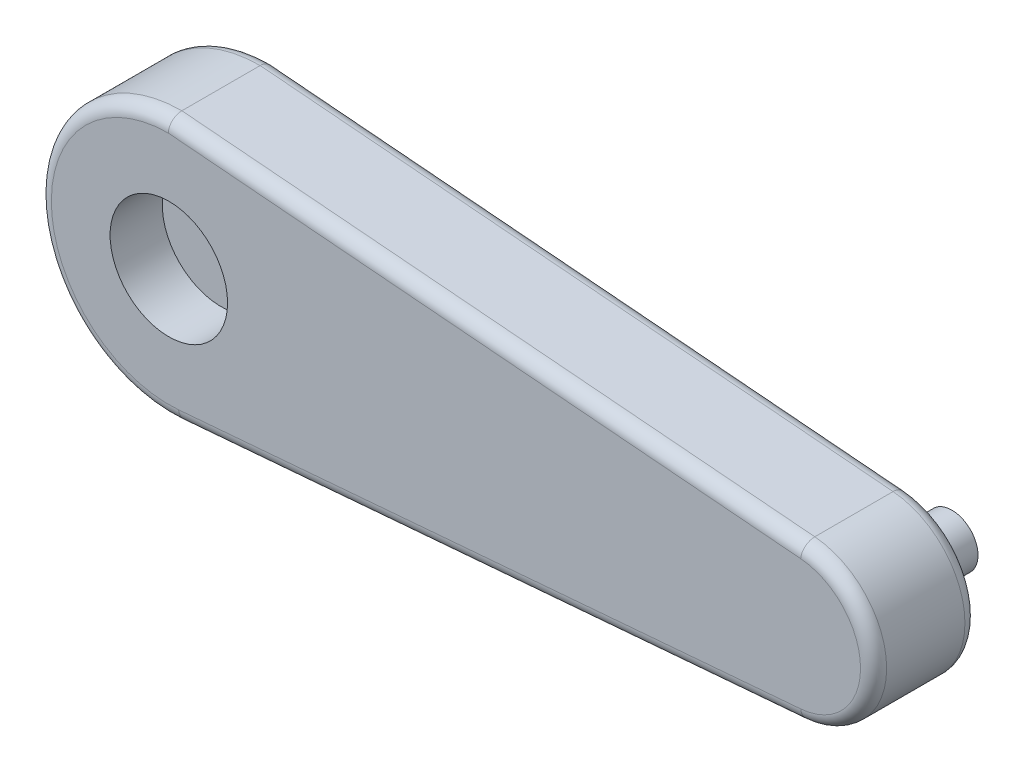
ISO-10303-21;
HEADER;
FILE_DESCRIPTION(('STEP AP214'),'2;1');
FILE_NAME('part.step','',(''),(''),'','','');
FILE_SCHEMA(('AUTOMOTIVE_DESIGN { 1 0 10303 214 1 1 1 1 }'));
ENDSEC;
DATA;
#1=APPLICATION_CONTEXT('core data for automotive mechanical design processes');
#2=APPLICATION_PROTOCOL_DEFINITION('international standard','automotive_design',2000,#1);
#3=PRODUCT_CONTEXT('',#1,'mechanical');
#4=PRODUCT('Part','Part','',(#3));
#5=PRODUCT_RELATED_PRODUCT_CATEGORY('part','',(#4));
#6=PRODUCT_DEFINITION_FORMATION('','',#4);
#7=PRODUCT_DEFINITION_CONTEXT('part definition',#1,'design');
#8=PRODUCT_DEFINITION('design','',#6,#7);
#9=PRODUCT_DEFINITION_SHAPE('','',#8);
#10=(LENGTH_UNIT() NAMED_UNIT(*) SI_UNIT(.MILLI.,.METRE.));
#11=(NAMED_UNIT(*) PLANE_ANGLE_UNIT() SI_UNIT($,.RADIAN.));
#12=(NAMED_UNIT(*) SI_UNIT($,.STERADIAN.) SOLID_ANGLE_UNIT());
#13=UNCERTAINTY_MEASURE_WITH_UNIT(LENGTH_MEASURE(1.E-05),#10,'distance_accuracy_value','');
#14=(GEOMETRIC_REPRESENTATION_CONTEXT(3) GLOBAL_UNCERTAINTY_ASSIGNED_CONTEXT((#13)) GLOBAL_UNIT_ASSIGNED_CONTEXT((#10,
#11,#12)) REPRESENTATION_CONTEXT('',''));
#15=CARTESIAN_POINT('',(0.,0.,0.));
#16=DIRECTION('',(0.,0.,1.));
#17=DIRECTION('',(1.,0.,0.));
#18=AXIS2_PLACEMENT_3D('',#15,#16,#17);
#19=CARTESIAN_POINT('',(1.7139175257732,-20.4954726653671,20.));
#20=DIRECTION('',(-0.0833333333333334,0.996521728591783,0.));
#21=DIRECTION('',(-0.996521728591783,-0.0833333333333334,0.));
#22=AXIS2_PLACEMENT_3D('',#19,#20,#21);
#23=PLANE('',#22);
#24=DIRECTION('',(0.,0.,-1.));
#25=VECTOR('',#24,1.);
#26=CARTESIAN_POINT('',(-51.1125429553264,-24.9130432147946,20.));
#27=LINE('',#26,#25);
#28=CARTESIAN_POINT('',(-51.1125429553264,-24.9130432147946,17.5));
#29=VERTEX_POINT('',#28);
#30=CARTESIAN_POINT('',(-51.1125429553264,-24.9130432147946,2.5));
#31=VERTEX_POINT('',#30);
#32=EDGE_CURVE('E227',#29,#31,#27,.T.);
#33=ORIENTED_EDGE('',*,*,#32,.T.);
#34=DIRECTION('',(0.996521728591783,0.0833333333333334,0.));
#35=VECTOR('',#34,1.);
#36=CARTESIAN_POINT('',(1.7139175257732,-20.4954726653671,2.5));
#37=LINE('',#36,#35);
#38=CARTESIAN_POINT('',(68.0541237113402,-14.9478259288767,2.5));
#39=VERTEX_POINT('',#38);
#40=EDGE_CURVE('E63',#31,#39,#37,.T.);
#41=ORIENTED_EDGE('',*,*,#40,.T.);
#42=DIRECTION('',(0.,0.,-1.));
#43=VECTOR('',#42,1.);
#44=CARTESIAN_POINT('',(68.0541237113402,-14.9478259288767,20.));
#45=LINE('',#44,#43);
#46=CARTESIAN_POINT('',(68.0541237113402,-14.9478259288767,17.5));
#47=VERTEX_POINT('',#46);
#48=EDGE_CURVE('E136',#47,#39,#45,.T.);
#49=ORIENTED_EDGE('',*,*,#48,.F.);
#50=DIRECTION('',(0.996521728591783,0.0833333333333334,0.));
#51=VECTOR('',#50,1.);
#52=CARTESIAN_POINT('',(-51.1125429553264,-24.9130432147946,17.5));
#53=LINE('',#52,#51);
#54=EDGE_CURVE('E146',#47,#29,#53,.F.);
#55=ORIENTED_EDGE('',*,*,#54,.T.);
#56=EDGE_LOOP('',(#33,#41,#49,#55));
#57=FACE_BOUND('',#56,.T.);
#58=ADVANCED_FACE('F39',(#57),#23,.F.);
#59=CARTESIAN_POINT('',(66.8041237113402,0.,20.));
#60=DIRECTION('',(0.,0.,-1.));
#61=DIRECTION('',(-1.,0.,0.));
#62=AXIS2_PLACEMENT_3D('',#59,#60,#61);
#63=CYLINDRICAL_SURFACE('',#62,15.);
#64=ORIENTED_EDGE('',*,*,#48,.T.);
#65=CARTESIAN_POINT('',(66.8041237113402,0.,2.5));
#66=DIRECTION('',(0.,0.,1.));
#67=DIRECTION('',(1.,0.,0.));
#68=AXIS2_PLACEMENT_3D('',#65,#66,#67);
#69=CIRCLE('',#68,15.);
#70=CARTESIAN_POINT('',(68.0434394502578,14.9487155468044,2.5));
#71=VERTEX_POINT('',#70);
#72=EDGE_CURVE('E48',#39,#71,#69,.T.);
#73=ORIENTED_EDGE('',*,*,#72,.T.);
#74=DIRECTION('',(0.,0.,-1.));
#75=VECTOR('',#74,1.);
#76=CARTESIAN_POINT('',(68.0434394502578,14.9487155468044,20.));
#77=LINE('',#76,#75);
#78=CARTESIAN_POINT('',(68.0434394502578,14.9487155468044,17.5));
#79=VERTEX_POINT('',#78);
#80=EDGE_CURVE('E234',#79,#71,#77,.T.);
#81=ORIENTED_EDGE('',*,*,#80,.F.);
#82=CARTESIAN_POINT('',(66.8041237113402,0.,17.5));
#83=DIRECTION('',(0.,0.,1.));
#84=DIRECTION('',(1.,0.,0.));
#85=AXIS2_PLACEMENT_3D('',#82,#83,#84);
#86=CIRCLE('',#85,15.);
#87=EDGE_CURVE('E124',#79,#47,#86,.F.);
#88=ORIENTED_EDGE('',*,*,#87,.T.);
#89=EDGE_LOOP('',(#64,#73,#81,#88));
#90=FACE_BOUND('',#89,.T.);
#91=ADVANCED_FACE('F241',(#90),#63,.T.);
#92=CARTESIAN_POINT('',(1.69533657212367,20.449271623796,20.));
#93=DIRECTION('',(0.0826210492611721,0.996581036453626,0.));
#94=DIRECTION('',(-0.996581036453626,0.0826210492611721,0.));
#95=AXIS2_PLACEMENT_3D('',#92,#93,#94);
#96=PLANE('',#95);
#97=ORIENTED_EDGE('',*,*,#80,.T.);
#98=DIRECTION('',(0.996581036453626,-0.0826210492611721,0.));
#99=VECTOR('',#98,1.);
#100=CARTESIAN_POINT('',(-53.1958762886598,25.,2.5));
#101=LINE('',#100,#99);
#102=CARTESIAN_POINT('',(-53.1958762886598,25.,2.5));
#103=VERTEX_POINT('',#102);
#104=EDGE_CURVE('E11',#71,#103,#101,.F.);
#105=ORIENTED_EDGE('',*,*,#104,.T.);
#106=DIRECTION('',(0.,0.,-1.));
#107=VECTOR('',#106,1.);
#108=CARTESIAN_POINT('',(-53.1958762886598,25.,20.));
#109=LINE('',#108,#107);
#110=CARTESIAN_POINT('',(-53.1958762886598,25.,17.5));
#111=VERTEX_POINT('',#110);
#112=EDGE_CURVE('E230',#111,#103,#109,.T.);
#113=ORIENTED_EDGE('',*,*,#112,.F.);
#114=DIRECTION('',(0.996581036453626,-0.0826210492611721,0.));
#115=VECTOR('',#114,1.);
#116=CARTESIAN_POINT('',(1.69533657212367,20.449271623796,17.5));
#117=LINE('',#116,#115);
#118=EDGE_CURVE('E149',#111,#79,#117,.T.);
#119=ORIENTED_EDGE('',*,*,#118,.T.);
#120=EDGE_LOOP('',(#97,#105,#113,#119));
#121=FACE_BOUND('',#120,.T.);
#122=ADVANCED_FACE('F244',(#121),#96,.T.);
#123=CARTESIAN_POINT('',(-53.1958762886598,0.,20.));
#124=DIRECTION('',(0.,0.,-1.));
#125=DIRECTION('',(-1.,0.,0.));
#126=AXIS2_PLACEMENT_3D('',#123,#124,#125);
#127=CYLINDRICAL_SURFACE('',#126,25.);
#128=ORIENTED_EDGE('',*,*,#112,.T.);
#129=CARTESIAN_POINT('',(-53.1958762886598,0.,2.5));
#130=DIRECTION('',(0.,0.,1.));
#131=DIRECTION('',(1.,0.,0.));
#132=AXIS2_PLACEMENT_3D('',#129,#130,#131);
#133=CIRCLE('',#132,25.);
#134=EDGE_CURVE('E151',#103,#31,#133,.T.);
#135=ORIENTED_EDGE('',*,*,#134,.T.);
#136=ORIENTED_EDGE('',*,*,#32,.F.);
#137=CARTESIAN_POINT('',(-53.1958762886598,0.,17.5));
#138=DIRECTION('',(0.,0.,1.));
#139=DIRECTION('',(1.,0.,0.));
#140=AXIS2_PLACEMENT_3D('',#137,#138,#139);
#141=CIRCLE('',#140,25.);
#142=EDGE_CURVE('E143',#29,#111,#141,.F.);
#143=ORIENTED_EDGE('',*,*,#142,.T.);
#144=EDGE_LOOP('',(#128,#135,#136,#143));
#145=FACE_BOUND('',#144,.T.);
#146=ADVANCED_FACE('F226',(#145),#127,.T.);
#147=CARTESIAN_POINT('',(0.,0.,20.));
#148=DIRECTION('',(0.,0.,1.));
#149=DIRECTION('',(1.,0.,0.));
#150=AXIS2_PLACEMENT_3D('',#147,#148,#149);
#151=PLANE('',#150);
#152=DIRECTION('',(0.996581036453626,-0.0826210492611721,0.));
#153=VECTOR('',#152,1.);
#154=CARTESIAN_POINT('',(1.48878394897074,17.957819032662,20.));
#155=LINE('',#154,#153);
#156=CARTESIAN_POINT('',(67.8368868271049,12.4572629556703,20.));
#157=VERTEX_POINT('',#156);
#158=CARTESIAN_POINT('',(-53.2966095251437,22.4997745058716,20.));
#159=VERTEX_POINT('',#158);
#160=EDGE_CURVE('E112',#157,#159,#155,.F.);
#161=ORIENTED_EDGE('',*,*,#160,.T.);
#162=CARTESIAN_POINT('',(-53.1958762886598,0.,20.));
#163=DIRECTION('',(0.,0.,1.));
#164=DIRECTION('',(1.,0.,0.));
#165=AXIS2_PLACEMENT_3D('',#162,#163,#164);
#166=CIRCLE('',#165,22.5);
#167=CARTESIAN_POINT('',(-51.3208762886598,-22.4217388933151,20.));
#168=VERTEX_POINT('',#167);
#169=EDGE_CURVE('E141',#159,#168,#166,.T.);
#170=ORIENTED_EDGE('',*,*,#169,.T.);
#171=DIRECTION('',(0.996521728591783,0.0833333333333334,0.));
#172=VECTOR('',#171,1.);
#173=CARTESIAN_POINT('',(67.8457903780069,-12.4565216073973,20.));
#174=LINE('',#173,#172);
#175=CARTESIAN_POINT('',(67.8457903780069,-12.4565216073973,20.));
#176=VERTEX_POINT('',#175);
#177=EDGE_CURVE('E115',#168,#176,#174,.T.);
#178=ORIENTED_EDGE('',*,*,#177,.T.);
#179=CARTESIAN_POINT('',(66.8041237113402,0.,20.));
#180=DIRECTION('',(0.,0.,1.));
#181=DIRECTION('',(1.,0.,0.));
#182=AXIS2_PLACEMENT_3D('',#179,#180,#181);
#183=CIRCLE('',#182,12.5);
#184=EDGE_CURVE('E106',#176,#157,#183,.T.);
#185=ORIENTED_EDGE('',*,*,#184,.T.);
#186=EDGE_LOOP('',(#161,#170,#178,#185));
#187=FACE_BOUND('',#186,.T.);
#188=CARTESIAN_POINT('',(-53.1958762886598,0.,20.));
#189=DIRECTION('',(0.,0.,1.));
#190=DIRECTION('',(1.,0.,0.));
#191=AXIS2_PLACEMENT_3D('',#188,#189,#190);
#192=CIRCLE('',#191,11.25);
#193=CARTESIAN_POINT('',(-41.9458762886598,0.,20.));
#194=VERTEX_POINT('',#193);
#195=EDGE_CURVE('E127',#194,#194,#192,.T.);
#196=ORIENTED_EDGE('',*,*,#195,.F.);
#197=EDGE_LOOP('',(#196));
#198=FACE_BOUND('',#197,.T.);
#199=ADVANCED_FACE('F108',(#187,#198),#151,.T.);
#200=CARTESIAN_POINT('',(0.,0.,0.));
#201=DIRECTION('',(0.,0.,1.));
#202=DIRECTION('',(1.,0.,0.));
#203=AXIS2_PLACEMENT_3D('',#200,#201,#202);
#204=PLANE('',#203);
#205=DIRECTION('',(0.996521728591783,0.0833333333333334,0.));
#206=VECTOR('',#205,1.);
#207=CARTESIAN_POINT('',(1.50558419243986,-18.0041683438876,0.));
#208=LINE('',#207,#206);
#209=CARTESIAN_POINT('',(67.8457903780069,-12.4565216073973,0.));
#210=VERTEX_POINT('',#209);
#211=CARTESIAN_POINT('',(-51.3208762886598,-22.4217388933151,0.));
#212=VERTEX_POINT('',#211);
#213=EDGE_CURVE('E208',#210,#212,#208,.F.);
#214=ORIENTED_EDGE('',*,*,#213,.T.);
#215=CARTESIAN_POINT('',(-53.1958762886598,0.,0.));
#216=DIRECTION('',(0.,0.,1.));
#217=DIRECTION('',(1.,0.,0.));
#218=AXIS2_PLACEMENT_3D('',#215,#216,#217);
#219=CIRCLE('',#218,22.5);
#220=CARTESIAN_POINT('',(-53.2966095251437,22.4997745058716,0.));
#221=VERTEX_POINT('',#220);
#222=EDGE_CURVE('E210',#212,#221,#219,.F.);
#223=ORIENTED_EDGE('',*,*,#222,.T.);
#224=DIRECTION('',(0.996581036453626,-0.0826210492611721,0.));
#225=VECTOR('',#224,1.);
#226=CARTESIAN_POINT('',(67.8368868271049,12.4572629556703,0.));
#227=LINE('',#226,#225);
#228=CARTESIAN_POINT('',(67.8368868271049,12.4572629556703,0.));
#229=VERTEX_POINT('',#228);
#230=EDGE_CURVE('E202',#221,#229,#227,.T.);
#231=ORIENTED_EDGE('',*,*,#230,.T.);
#232=CARTESIAN_POINT('',(66.8041237113402,0.,0.));
#233=DIRECTION('',(0.,0.,1.));
#234=DIRECTION('',(1.,0.,0.));
#235=AXIS2_PLACEMENT_3D('',#232,#233,#234);
#236=CIRCLE('',#235,12.5);
#237=EDGE_CURVE('E206',#229,#210,#236,.F.);
#238=ORIENTED_EDGE('',*,*,#237,.T.);
#239=EDGE_LOOP('',(#214,#223,#231,#238));
#240=FACE_BOUND('',#239,.T.);
#241=CARTESIAN_POINT('',(66.8041237113402,0.,0.));
#242=DIRECTION('',(0.,0.,1.));
#243=DIRECTION('',(1.,0.,0.));
#244=AXIS2_PLACEMENT_3D('',#241,#242,#243);
#245=CIRCLE('',#244,5.);
#246=CARTESIAN_POINT('',(71.8041237113402,0.,0.));
#247=VERTEX_POINT('',#246);
#248=EDGE_CURVE('E133',#247,#247,#245,.F.);
#249=ORIENTED_EDGE('',*,*,#248,.F.);
#250=EDGE_LOOP('',(#249));
#251=FACE_BOUND('',#250,.T.);
#252=ADVANCED_FACE('F218',(#240,#251),#204,.F.);
#253=CARTESIAN_POINT('',(66.8041237113402,0.,-10.));
#254=DIRECTION('',(0.,0.,1.));
#255=DIRECTION('',(1.,0.,0.));
#256=AXIS2_PLACEMENT_3D('',#253,#254,#255);
#257=CYLINDRICAL_SURFACE('',#256,5.);
#258=CARTESIAN_POINT('',(66.8041237113402,0.,-10.));
#259=DIRECTION('',(0.,0.,-1.));
#260=DIRECTION('',(-1.,0.,0.));
#261=AXIS2_PLACEMENT_3D('',#258,#259,#260);
#262=CIRCLE('',#261,5.);
#263=CARTESIAN_POINT('',(61.8041237113402,0.,-10.));
#264=VERTEX_POINT('',#263);
#265=EDGE_CURVE('E232',#264,#264,#262,.T.);
#266=ORIENTED_EDGE('',*,*,#265,.F.);
#267=EDGE_LOOP('',(#266));
#268=FACE_BOUND('',#267,.T.);
#269=ORIENTED_EDGE('',*,*,#248,.T.);
#270=EDGE_LOOP('',(#269));
#271=FACE_BOUND('',#270,.T.);
#272=ADVANCED_FACE('F283',(#268,#271),#257,.T.);
#273=CARTESIAN_POINT('',(66.8041237113402,0.,-10.));
#274=DIRECTION('',(0.,0.,-1.));
#275=DIRECTION('',(-1.,0.,0.));
#276=AXIS2_PLACEMENT_3D('',#273,#274,#275);
#277=PLANE('',#276);
#278=ORIENTED_EDGE('',*,*,#265,.T.);
#279=EDGE_LOOP('',(#278));
#280=FACE_BOUND('',#279,.T.);
#281=ADVANCED_FACE('F354',(#280),#277,.T.);
#282=CARTESIAN_POINT('',(-53.1958762886598,0.,10.));
#283=DIRECTION('',(0.,0.,1.));
#284=DIRECTION('',(1.,0.,0.));
#285=AXIS2_PLACEMENT_3D('',#282,#283,#284);
#286=CYLINDRICAL_SURFACE('',#285,11.25);
#287=CARTESIAN_POINT('',(-53.1958762886598,0.,10.));
#288=DIRECTION('',(0.,0.,1.));
#289=DIRECTION('',(1.,0.,0.));
#290=AXIS2_PLACEMENT_3D('',#287,#288,#289);
#291=CIRCLE('',#290,11.25);
#292=CARTESIAN_POINT('',(-41.9458762886598,0.,10.));
#293=VERTEX_POINT('',#292);
#294=EDGE_CURVE('E237',#293,#293,#291,.T.);
#295=ORIENTED_EDGE('',*,*,#294,.F.);
#296=EDGE_LOOP('',(#295));
#297=FACE_BOUND('',#296,.T.);
#298=ORIENTED_EDGE('',*,*,#195,.T.);
#299=EDGE_LOOP('',(#298));
#300=FACE_BOUND('',#299,.T.);
#301=ADVANCED_FACE('F345',(#297,#300),#286,.F.);
#302=CARTESIAN_POINT('',(-53.1958762886598,0.,10.));
#303=DIRECTION('',(0.,0.,1.));
#304=DIRECTION('',(1.,0.,0.));
#305=AXIS2_PLACEMENT_3D('',#302,#303,#304);
#306=PLANE('',#305);
#307=ORIENTED_EDGE('',*,*,#294,.T.);
#308=EDGE_LOOP('',(#307));
#309=FACE_BOUND('',#308,.T.);
#310=ADVANCED_FACE('F174',(#309),#306,.T.);
#311=CARTESIAN_POINT('',(66.8041237113402,0.,17.5));
#312=DIRECTION('',(0.,0.,1.));
#313=DIRECTION('',(1.,0.,0.));
#314=AXIS2_PLACEMENT_3D('',#311,#312,#313);
#315=TOROIDAL_SURFACE('',#314,12.5,2.5);
#316=CARTESIAN_POINT('',(67.8457903780069,-12.4565216073973,17.5));
#317=DIRECTION('',(-0.996521728591783,-0.0833333333333353,0.));
#318=DIRECTION('',(0.0833333333333353,-0.996521728591783,0.));
#319=AXIS2_PLACEMENT_3D('',#316,#317,#318);
#320=CIRCLE('',#319,2.5);
#321=EDGE_CURVE('E128',#47,#176,#320,.T.);
#322=ORIENTED_EDGE('',*,*,#321,.F.);
#323=ORIENTED_EDGE('',*,*,#87,.F.);
#324=CARTESIAN_POINT('',(67.8368868271049,12.4572629556703,17.5));
#325=DIRECTION('',(-0.996581036453626,0.0826210492611723,0.));
#326=DIRECTION('',(-0.0826210492611723,-0.996581036453626,0.));
#327=AXIS2_PLACEMENT_3D('',#324,#325,#326);
#328=CIRCLE('',#327,2.5);
#329=EDGE_CURVE('E122',#157,#79,#328,.T.);
#330=ORIENTED_EDGE('',*,*,#329,.F.);
#331=ORIENTED_EDGE('',*,*,#184,.F.);
#332=EDGE_LOOP('',(#322,#323,#330,#331));
#333=FACE_BOUND('',#332,.T.);
#334=ADVANCED_FACE('F123',(#333),#315,.T.);
#335=CARTESIAN_POINT('',(1.48878394897074,17.957819032662,17.5));
#336=DIRECTION('',(0.996581036453626,-0.0826210492611721,0.));
#337=DIRECTION('',(0.0826210492611721,0.996581036453626,0.));
#338=AXIS2_PLACEMENT_3D('',#335,#336,#337);
#339=CYLINDRICAL_SURFACE('',#338,2.5);
#340=ORIENTED_EDGE('',*,*,#329,.T.);
#341=ORIENTED_EDGE('',*,*,#118,.F.);
#342=CARTESIAN_POINT('',(-53.1958762886598,25.,17.5));
#343=CARTESIAN_POINT('',(-53.1958759627218,25.0000067646959,17.570269827713));
#344=CARTESIAN_POINT('',(-53.1959988868822,24.9970373167771,17.6405364422231));
#345=CARTESIAN_POINT('',(-53.1964887360333,24.9851983396675,17.7805666456857));
#346=CARTESIAN_POINT('',(-53.196855648953,24.9763291023603,17.8503302593509));
#347=CARTESIAN_POINT('',(-53.1978306294573,24.9527512785051,17.9888155876816));
#348=CARTESIAN_POINT('',(-53.1984385251329,24.9380468545776,18.0575380088948));
#349=CARTESIAN_POINT('',(-53.1998898593822,24.9029184335901,18.1934819264553));
#350=CARTESIAN_POINT('',(-53.2007332951599,24.8824945044256,18.2607034406095));
#351=CARTESIAN_POINT('',(-53.2036087888336,24.8128099648483,18.4594665242395));
#352=CARTESIAN_POINT('',(-53.2059864454095,24.7551266622543,18.588164702322));
#353=CARTESIAN_POINT('',(-53.2115822593283,24.6190390170846,18.8339450295507));
#354=CARTESIAN_POINT('',(-53.2148002243288,24.5406394163156,18.9510298284889));
#355=CARTESIAN_POINT('',(-53.2219754163927,24.3652930626531,19.1704329006143));
#356=CARTESIAN_POINT('',(-53.2259328793421,24.2683403914376,19.2727464435352));
#357=CARTESIAN_POINT('',(-53.2344619584077,24.0586250045979,19.4596759445647));
#358=CARTESIAN_POINT('',(-53.2390337778412,23.9458570544646,19.5442860200165));
#359=CARTESIAN_POINT('',(-53.2486518691355,23.7076265371377,19.6934624865873));
#360=CARTESIAN_POINT('',(-53.2536986488018,23.5821503717424,19.7580071000824));
#361=CARTESIAN_POINT('',(-53.2641056766057,23.3222025701286,19.8650649084877));
#362=CARTESIAN_POINT('',(-53.2694656530049,23.1877387177261,19.9075968953678));
#363=CARTESIAN_POINT('',(-53.2782656195033,22.9658796005711,19.9577264883606));
#364=CARTESIAN_POINT('',(-53.2816610103312,22.8800203168831,19.9724577984989));
#365=CARTESIAN_POINT('',(-53.2884691353077,22.7073192688584,19.9928843056152));
#366=CARTESIAN_POINT('',(-53.2918818340913,22.6204792482232,19.9985935780653));
#367=CARTESIAN_POINT('',(-53.2957258207509,22.5223483403761,19.9999237598853));
#368=CARTESIAN_POINT('',(-53.2961677890399,22.5110608445725,20.000000200745));
#369=CARTESIAN_POINT('',(-53.2966095251428,22.4997745058713,20.));
#370=B_SPLINE_CURVE_WITH_KNOTS('',3,(#342,#343,#344,#345,#346,#347,#348,#349,#350,#351,#352,
#353,#354,#355,#356,#357,#358,#359,#360,#361,#362,#363,#364,#365,#366,#367,#368,#369),
.UNSPECIFIED.,.F.,.F.,(4,2,2,2,2,2,2,2,2,2,2,2,2,4),(0.,0.210740866020781,0.421471306715878,
0.632051689051588,0.842629571717319,1.26361082305076,1.68449579824766,2.10551525779902,
2.52667439583228,2.94828904695332,3.36954317349001,3.6306789857998,3.89140699095154,
3.92529498574),.UNSPECIFIED.);
#371=EDGE_CURVE('E131',#159,#111,#370,.F.);
#372=ORIENTED_EDGE('',*,*,#371,.F.);
#373=ORIENTED_EDGE('',*,*,#160,.F.);
#374=EDGE_LOOP('',(#340,#341,#372,#373));
#375=FACE_BOUND('',#374,.T.);
#376=ADVANCED_FACE('F130',(#375),#339,.T.);
#377=CARTESIAN_POINT('',(1.50558419243986,-18.0041683438876,17.5));
#378=DIRECTION('',(-0.996521728591783,-0.0833333333333334,0.));
#379=DIRECTION('',(0.0833333333333334,-0.996521728591783,0.));
#380=AXIS2_PLACEMENT_3D('',#377,#378,#379);
#381=CYLINDRICAL_SURFACE('',#380,2.5);
#382=ORIENTED_EDGE('',*,*,#321,.T.);
#383=ORIENTED_EDGE('',*,*,#177,.F.);
#384=CARTESIAN_POINT('',(-51.3208762886598,-22.4217388933151,17.5));
#385=DIRECTION('',(-0.996521728591783,-0.0833333333333325,0.));
#386=DIRECTION('',(0.0833333333333325,-0.996521728591783,0.));
#387=AXIS2_PLACEMENT_3D('',#384,#385,#386);
#388=CIRCLE('',#387,2.5);
#389=EDGE_CURVE('E152',#29,#168,#388,.T.);
#390=ORIENTED_EDGE('',*,*,#389,.F.);
#391=ORIENTED_EDGE('',*,*,#54,.F.);
#392=EDGE_LOOP('',(#382,#383,#390,#391));
#393=FACE_BOUND('',#392,.T.);
#394=ADVANCED_FACE('F167',(#393),#381,.T.);
#395=CARTESIAN_POINT('',(-53.1958762886598,0.,17.5));
#396=DIRECTION('',(0.,0.,1.));
#397=DIRECTION('',(1.,0.,0.));
#398=AXIS2_PLACEMENT_3D('',#395,#396,#397);
#399=TOROIDAL_SURFACE('',#398,22.5,2.5);
#400=ORIENTED_EDGE('',*,*,#371,.T.);
#401=ORIENTED_EDGE('',*,*,#142,.F.);
#402=ORIENTED_EDGE('',*,*,#389,.T.);
#403=ORIENTED_EDGE('',*,*,#169,.F.);
#404=EDGE_LOOP('',(#400,#401,#402,#403));
#405=FACE_BOUND('',#404,.T.);
#406=ADVANCED_FACE('F163',(#405),#399,.T.);
#407=CARTESIAN_POINT('',(66.8041237113402,0.,2.5));
#408=DIRECTION('',(0.,0.,1.));
#409=DIRECTION('',(1.,0.,0.));
#410=AXIS2_PLACEMENT_3D('',#407,#408,#409);
#411=TOROIDAL_SURFACE('',#410,12.5,2.5);
#412=CARTESIAN_POINT('',(67.8457903780069,-12.4565216073973,2.5));
#413=DIRECTION('',(-0.996521728591783,-0.0833333333333352,0.));
#414=DIRECTION('',(0.0833333333333352,-0.996521728591783,0.));
#415=AXIS2_PLACEMENT_3D('',#412,#413,#414);
#416=CIRCLE('',#415,2.5);
#417=EDGE_CURVE('E190',#210,#39,#416,.T.);
#418=ORIENTED_EDGE('',*,*,#417,.F.);
#419=ORIENTED_EDGE('',*,*,#237,.F.);
#420=CARTESIAN_POINT('',(67.8368868271049,12.4572629556703,2.5));
#421=DIRECTION('',(-0.996581036453626,0.0826210492611723,0.));
#422=DIRECTION('',(-0.0826210492611723,-0.996581036453626,0.));
#423=AXIS2_PLACEMENT_3D('',#420,#421,#422);
#424=CIRCLE('',#423,2.5);
#425=EDGE_CURVE('E43',#71,#229,#424,.T.);
#426=ORIENTED_EDGE('',*,*,#425,.F.);
#427=ORIENTED_EDGE('',*,*,#72,.F.);
#428=EDGE_LOOP('',(#418,#419,#426,#427));
#429=FACE_BOUND('',#428,.T.);
#430=ADVANCED_FACE('F41',(#429),#411,.T.);
#431=CARTESIAN_POINT('',(1.48878394897074,17.957819032662,2.5));
#432=DIRECTION('',(-0.996581036453626,0.0826210492611721,0.));
#433=DIRECTION('',(-0.0826210492611721,-0.996581036453626,0.));
#434=AXIS2_PLACEMENT_3D('',#431,#432,#433);
#435=CYLINDRICAL_SURFACE('',#434,2.5);
#436=ORIENTED_EDGE('',*,*,#425,.T.);
#437=ORIENTED_EDGE('',*,*,#230,.F.);
#438=CARTESIAN_POINT('',(-53.1958762886598,25.,2.5));
#439=CARTESIAN_POINT('',(-53.1958759627218,25.0000067646959,2.42973017228697));
#440=CARTESIAN_POINT('',(-53.1959988868822,24.9970373167771,2.35946355777686));
#441=CARTESIAN_POINT('',(-53.1964887360333,24.9851983396675,2.21943335431426));
#442=CARTESIAN_POINT('',(-53.196855648953,24.9763291023603,2.14966974064912));
#443=CARTESIAN_POINT('',(-53.1978306294573,24.9527512785051,2.0111844123184));
#444=CARTESIAN_POINT('',(-53.1984385251329,24.9380468545776,1.94246199110519));
#445=CARTESIAN_POINT('',(-53.1998898593822,24.9029184335901,1.80651807354469));
#446=CARTESIAN_POINT('',(-53.2007332951599,24.8824945044256,1.73929655939052));
#447=CARTESIAN_POINT('',(-53.2036087888336,24.8128099648483,1.54053347576047));
#448=CARTESIAN_POINT('',(-53.2059864454095,24.7551266622543,1.41183529767801));
#449=CARTESIAN_POINT('',(-53.2115822593283,24.6190390170846,1.16605497044928));
#450=CARTESIAN_POINT('',(-53.2148002243288,24.5406394163156,1.04897017151106));
#451=CARTESIAN_POINT('',(-53.2219754163927,24.3652930626531,0.829567099385692));
#452=CARTESIAN_POINT('',(-53.2259328793422,24.2683403914376,0.727253556464775));
#453=CARTESIAN_POINT('',(-53.2344619584078,24.0586250045979,0.540324055435266));
#454=CARTESIAN_POINT('',(-53.2390337778413,23.9458570544646,0.455713979983501));
#455=CARTESIAN_POINT('',(-53.2486518691355,23.7076265371377,0.306537513412698));
#456=CARTESIAN_POINT('',(-53.2536986488017,23.5821503717424,0.2419928999176));
#457=CARTESIAN_POINT('',(-53.2641056766059,23.3222025701286,0.134935091512277));
#458=CARTESIAN_POINT('',(-53.2694656530054,23.1877387177261,0.0924031046321965));
#459=CARTESIAN_POINT('',(-53.2782656195031,22.9658796005711,0.0422735116393844));
#460=CARTESIAN_POINT('',(-53.2816610103304,22.880020316883,0.027542201501103));
#461=CARTESIAN_POINT('',(-53.2884691353087,22.7073192688584,0.00711569438484178));
#462=CARTESIAN_POINT('',(-53.2918818340944,22.6204792482233,0.00140642193468262));
#463=CARTESIAN_POINT('',(-53.2957258207517,22.5223483403761,7.62401147385805E-05));
#464=CARTESIAN_POINT('',(-53.2961677890404,22.5110608445725,-2.00744989922389E-07));
#465=CARTESIAN_POINT('',(-53.2966095251428,22.4997745058713,0.));
#466=B_SPLINE_CURVE_WITH_KNOTS('',3,(#438,#439,#440,#441,#442,#443,#444,#445,#446,#447,#448,
#449,#450,#451,#452,#453,#454,#455,#456,#457,#458,#459,#460,#461,#462,#463,#464,#465),
.UNSPECIFIED.,.F.,.F.,(4,2,2,2,2,2,2,2,2,2,2,2,2,4),(0.,0.210740866020782,0.421471306715879,
0.63205168905159,0.842629571717319,1.26361082305076,1.68449579824765,2.10551525779902,
2.52667439583228,2.94828904695332,3.36954317349001,3.6306789857998,3.89140699095153,
3.92529498574),.UNSPECIFIED.);
#467=EDGE_CURVE('E184',#103,#221,#466,.T.);
#468=ORIENTED_EDGE('',*,*,#467,.F.);
#469=ORIENTED_EDGE('',*,*,#104,.F.);
#470=EDGE_LOOP('',(#436,#437,#468,#469));
#471=FACE_BOUND('',#470,.T.);
#472=ADVANCED_FACE('F181',(#471),#435,.T.);
#473=CARTESIAN_POINT('',(1.50558419243986,-18.0041683438876,2.5));
#474=DIRECTION('',(0.996521728591783,0.0833333333333334,0.));
#475=DIRECTION('',(-0.0833333333333334,0.996521728591783,0.));
#476=AXIS2_PLACEMENT_3D('',#473,#474,#475);
#477=CYLINDRICAL_SURFACE('',#476,2.5);
#478=ORIENTED_EDGE('',*,*,#417,.T.);
#479=ORIENTED_EDGE('',*,*,#40,.F.);
#480=CARTESIAN_POINT('',(-51.3208762886598,-22.4217388933151,2.5));
#481=DIRECTION('',(-0.996521728591783,-0.0833333333333325,0.));
#482=DIRECTION('',(0.0833333333333325,-0.996521728591783,0.));
#483=AXIS2_PLACEMENT_3D('',#480,#481,#482);
#484=CIRCLE('',#483,2.5);
#485=EDGE_CURVE('E191',#212,#31,#484,.T.);
#486=ORIENTED_EDGE('',*,*,#485,.F.);
#487=ORIENTED_EDGE('',*,*,#213,.F.);
#488=EDGE_LOOP('',(#478,#479,#486,#487));
#489=FACE_BOUND('',#488,.T.);
#490=ADVANCED_FACE('F179',(#489),#477,.T.);
#491=CARTESIAN_POINT('',(-53.1958762886598,0.,2.5));
#492=DIRECTION('',(0.,0.,1.));
#493=DIRECTION('',(1.,0.,0.));
#494=AXIS2_PLACEMENT_3D('',#491,#492,#493);
#495=TOROIDAL_SURFACE('',#494,22.5,2.5);
#496=ORIENTED_EDGE('',*,*,#467,.T.);
#497=ORIENTED_EDGE('',*,*,#222,.F.);
#498=ORIENTED_EDGE('',*,*,#485,.T.);
#499=ORIENTED_EDGE('',*,*,#134,.F.);
#500=EDGE_LOOP('',(#496,#497,#498,#499));
#501=FACE_BOUND('',#500,.T.);
#502=ADVANCED_FACE('F175',(#501),#495,.T.);
#503=CLOSED_SHELL('',(#58,#91,#122,#146,#199,#252,#272,#281,#301,#310,#334,#376,#394,#406,#430,
#472,#490,#502));
#504=MANIFOLD_SOLID_BREP('B2',#503);
#505=ADVANCED_BREP_SHAPE_REPRESENTATION('',(#18,#504),#14);
#506=SHAPE_DEFINITION_REPRESENTATION(#9,#505);
ENDSEC;
END-ISO-10303-21;
